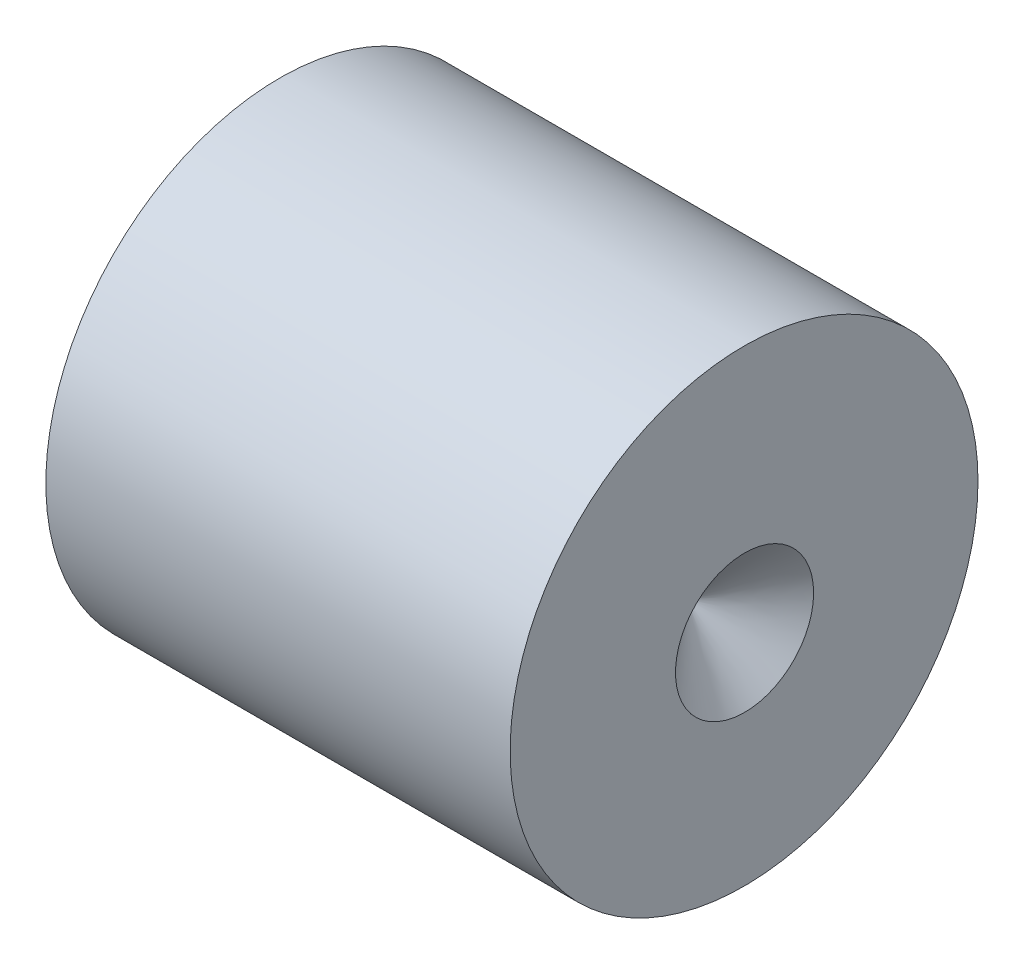
ISO-10303-21;
HEADER;
FILE_DESCRIPTION(('STEP AP214'),'2;1');
FILE_NAME('part.step','',(''),(''),'','','');
FILE_SCHEMA(('AUTOMOTIVE_DESIGN { 1 0 10303 214 1 1 1 1 }'));
ENDSEC;
DATA;
#1=APPLICATION_CONTEXT('core data for automotive mechanical design processes');
#2=APPLICATION_PROTOCOL_DEFINITION('international standard','automotive_design',2000,#1);
#3=PRODUCT_CONTEXT('',#1,'mechanical');
#4=PRODUCT('Part','Part','',(#3));
#5=PRODUCT_RELATED_PRODUCT_CATEGORY('part','',(#4));
#6=PRODUCT_DEFINITION_FORMATION('','',#4);
#7=PRODUCT_DEFINITION_CONTEXT('part definition',#1,'design');
#8=PRODUCT_DEFINITION('design','',#6,#7);
#9=PRODUCT_DEFINITION_SHAPE('','',#8);
#10=(LENGTH_UNIT() NAMED_UNIT(*) SI_UNIT(.MILLI.,.METRE.));
#11=(NAMED_UNIT(*) PLANE_ANGLE_UNIT() SI_UNIT($,.RADIAN.));
#12=(NAMED_UNIT(*) SI_UNIT($,.STERADIAN.) SOLID_ANGLE_UNIT());
#13=UNCERTAINTY_MEASURE_WITH_UNIT(LENGTH_MEASURE(1.E-05),#10,'distance_accuracy_value','');
#14=(GEOMETRIC_REPRESENTATION_CONTEXT(3) GLOBAL_UNCERTAINTY_ASSIGNED_CONTEXT((#13)) GLOBAL_UNIT_ASSIGNED_CONTEXT((#10,
#11,#12)) REPRESENTATION_CONTEXT('',''));
#15=CARTESIAN_POINT('',(0.,0.,0.));
#16=DIRECTION('',(0.,0.,1.));
#17=DIRECTION('',(1.,0.,0.));
#18=AXIS2_PLACEMENT_3D('',#15,#16,#17);
#19=CARTESIAN_POINT('',(10.16,45.8221014837827,7.97795516905145));
#20=DIRECTION('',(-1.,0.,0.));
#21=DIRECTION('',(0.,0.,1.));
#22=AXIS2_PLACEMENT_3D('',#19,#20,#21);
#23=CYLINDRICAL_SURFACE('',#22,5.11907181179017);
#24=CARTESIAN_POINT('',(10.16,45.8221014837827,7.97795516905145));
#25=DIRECTION('',(1.,0.,0.));
#26=DIRECTION('',(0.,0.,-1.));
#27=AXIS2_PLACEMENT_3D('',#24,#25,#26);
#28=CIRCLE('',#27,5.11907181179017);
#29=CARTESIAN_POINT('',(10.16,45.8221014837827,2.85888335726128));
#30=VERTEX_POINT('',#29);
#31=EDGE_CURVE('E11',#30,#30,#28,.T.);
#32=ORIENTED_EDGE('',*,*,#31,.F.);
#33=EDGE_LOOP('',(#32));
#34=FACE_BOUND('',#33,.T.);
#35=CARTESIAN_POINT('',(0.,45.8221014837827,7.97795516905145));
#36=DIRECTION('',(1.,0.,0.));
#37=DIRECTION('',(0.,0.,-1.));
#38=AXIS2_PLACEMENT_3D('',#35,#36,#37);
#39=CIRCLE('',#38,5.11907181179017);
#40=CARTESIAN_POINT('',(0.,45.8221014837827,2.85888335726128));
#41=VERTEX_POINT('',#40);
#42=EDGE_CURVE('E36',#41,#41,#39,.T.);
#43=ORIENTED_EDGE('',*,*,#42,.T.);
#44=EDGE_LOOP('',(#43));
#45=FACE_BOUND('',#44,.T.);
#46=ADVANCED_FACE('F33',(#34,#45),#23,.T.);
#47=CARTESIAN_POINT('',(10.16,45.8221014837827,7.97795516905145));
#48=DIRECTION('',(1.,0.,0.));
#49=DIRECTION('',(0.,0.,-1.));
#50=AXIS2_PLACEMENT_3D('',#47,#48,#49);
#51=PLANE('',#50);
#52=CARTESIAN_POINT('',(10.16,45.5023528736015,7.96695319802565));
#53=DIRECTION('',(1.,0.,0.));
#54=DIRECTION('',(0.,0.,-1.));
#55=AXIS2_PLACEMENT_3D('',#52,#53,#54);
#56=CIRCLE('',#55,1.5113);
#57=CARTESIAN_POINT('',(10.16,45.5023528736015,6.45565319802565));
#58=VERTEX_POINT('',#57);
#59=EDGE_CURVE('E56',#58,#58,#56,.T.);
#60=ORIENTED_EDGE('',*,*,#59,.F.);
#61=EDGE_LOOP('',(#60));
#62=FACE_BOUND('',#61,.T.);
#63=ORIENTED_EDGE('',*,*,#31,.T.);
#64=EDGE_LOOP('',(#63));
#65=FACE_BOUND('',#64,.T.);
#66=ADVANCED_FACE('F80',(#62,#65),#51,.T.);
#67=CARTESIAN_POINT('',(0.,45.8221014837827,7.97795516905145));
#68=DIRECTION('',(1.,0.,0.));
#69=DIRECTION('',(0.,0.,-1.));
#70=AXIS2_PLACEMENT_3D('',#67,#68,#69);
#71=PLANE('',#70);
#72=CARTESIAN_POINT('',(0.,45.6054879122403,8.0544553026329));
#73=DIRECTION('',(-1.,0.,0.));
#74=DIRECTION('',(0.,0.,1.));
#75=AXIS2_PLACEMENT_3D('',#72,#73,#74);
#76=CIRCLE('',#75,1.5113);
#77=CARTESIAN_POINT('',(0.,45.6054879122403,9.5657553026329));
#78=VERTEX_POINT('',#77);
#79=EDGE_CURVE('E63',#78,#78,#76,.T.);
#80=ORIENTED_EDGE('',*,*,#79,.F.);
#81=EDGE_LOOP('',(#80));
#82=FACE_BOUND('',#81,.T.);
#83=ORIENTED_EDGE('',*,*,#42,.F.);
#84=EDGE_LOOP('',(#83));
#85=FACE_BOUND('',#84,.T.);
#86=ADVANCED_FACE('F77',(#82,#85),#71,.F.);
#87=CARTESIAN_POINT('',(6.096,45.5023528736015,7.96695319802565));
#88=DIRECTION('',(1.,0.,0.));
#89=DIRECTION('',(0.,0.,-1.));
#90=AXIS2_PLACEMENT_3D('',#87,#88,#89);
#91=CONICAL_SURFACE('',#90,0.0749300000000008,1.02974425867666);
#92=CARTESIAN_POINT('',(6.05097751381627,45.5023528736015,7.96695319802565));
#93=VERTEX_POINT('',#92);
#94=VERTEX_LOOP('',#93);
#95=FACE_BOUND('',#94,.T.);
#96=CARTESIAN_POINT('',(6.096,45.5023528736015,7.96695319802565));
#97=DIRECTION('',(1.,0.,0.));
#98=DIRECTION('',(0.,0.,-1.));
#99=AXIS2_PLACEMENT_3D('',#96,#97,#98);
#100=CIRCLE('',#99,0.0749300000000008);
#101=CARTESIAN_POINT('',(6.096,45.5023528736015,7.89202319802565));
#102=VERTEX_POINT('',#101);
#103=EDGE_CURVE('E69',#102,#102,#100,.T.);
#104=ORIENTED_EDGE('',*,*,#103,.T.);
#105=EDGE_LOOP('',(#104));
#106=FACE_BOUND('',#105,.T.);
#107=ADVANCED_FACE('F79',(#95,#106),#91,.F.);
#108=CARTESIAN_POINT('',(10.16,45.5023528736015,7.96695319802565));
#109=DIRECTION('',(1.,0.,0.));
#110=DIRECTION('',(0.,0.,-1.));
#111=AXIS2_PLACEMENT_3D('',#108,#109,#110);
#112=CYLINDRICAL_SURFACE('',#111,0.0749300000000008);
#113=ORIENTED_EDGE('',*,*,#103,.F.);
#114=EDGE_LOOP('',(#113));
#115=FACE_BOUND('',#114,.T.);
#116=CARTESIAN_POINT('',(8.95474246276589,45.5023528736015,7.96695319802565));
#117=DIRECTION('',(1.,0.,0.));
#118=DIRECTION('',(0.,0.,-1.));
#119=AXIS2_PLACEMENT_3D('',#116,#117,#118);
#120=CIRCLE('',#119,0.0749300000000008);
#121=CARTESIAN_POINT('',(8.95474246276589,45.5023528736015,7.89202319802565));
#122=VERTEX_POINT('',#121);
#123=EDGE_CURVE('E60',#122,#122,#120,.T.);
#124=ORIENTED_EDGE('',*,*,#123,.T.);
#125=EDGE_LOOP('',(#124));
#126=FACE_BOUND('',#125,.T.);
#127=ADVANCED_FACE('F87',(#115,#126),#112,.F.);
#128=CARTESIAN_POINT('',(10.16,45.5023528736015,7.96695319802565));
#129=DIRECTION('',(1.,0.,0.));
#130=DIRECTION('',(0.,0.,-1.));
#131=AXIS2_PLACEMENT_3D('',#128,#129,#130);
#132=CONICAL_SURFACE('',#131,1.5113,0.872664625997163);
#133=CARTESIAN_POINT('',(8.95474246276589,45.5023528736015,7.89202319802565));
#134=CARTESIAN_POINT('',(8.96729722877875,45.5023528736015,7.87706101052565));
#135=CARTESIAN_POINT('',(8.9798519947916,45.5023528736015,7.86209882302565));
#136=CARTESIAN_POINT('',(9.00496152681731,45.5023528736015,7.83217444802565));
#137=CARTESIAN_POINT('',(9.01751629283017,45.5023528736015,7.81721226052565));
#138=CARTESIAN_POINT('',(9.04262582485588,45.5023528736015,7.78728788552565));
#139=CARTESIAN_POINT('',(9.05518059086873,45.5023528736015,7.77232569802565));
#140=CARTESIAN_POINT('',(9.08029012289444,45.5023528736015,7.74240132302565));
#141=CARTESIAN_POINT('',(9.0928448889073,45.5023528736015,7.72743913552565));
#142=CARTESIAN_POINT('',(9.11795442093301,45.5023528736015,7.69751476052565));
#143=CARTESIAN_POINT('',(9.13050918694586,45.5023528736015,7.68255257302565));
#144=CARTESIAN_POINT('',(9.15561871897157,45.5023528736015,7.65262819802565));
#145=CARTESIAN_POINT('',(9.16817348498443,45.5023528736015,7.63766601052565));
#146=CARTESIAN_POINT('',(9.19328301701014,45.5023528736015,7.60774163552565));
#147=CARTESIAN_POINT('',(9.20583778302299,45.5023528736015,7.59277944802565));
#148=CARTESIAN_POINT('',(9.23094731504871,45.5023528736015,7.56285507302565));
#149=CARTESIAN_POINT('',(9.24350208106156,45.5023528736015,7.54789288552565));
#150=CARTESIAN_POINT('',(9.26861161308727,45.5023528736015,7.51796851052565));
#151=CARTESIAN_POINT('',(9.28116637910013,45.5023528736015,7.50300632302565));
#152=CARTESIAN_POINT('',(9.30627591112584,45.5023528736015,7.47308194802565));
#153=CARTESIAN_POINT('',(9.31883067713869,45.5023528736015,7.45811976052565));
#154=CARTESIAN_POINT('',(9.3439402091644,45.5023528736015,7.42819538552565));
#155=CARTESIAN_POINT('',(9.35649497517726,45.5023528736015,7.41323319802565));
#156=CARTESIAN_POINT('',(9.38160450720297,45.5023528736015,7.38330882302565));
#157=CARTESIAN_POINT('',(9.39415927321583,45.5023528736015,7.36834663552565));
#158=CARTESIAN_POINT('',(9.41926880524154,45.5023528736015,7.33842226052565));
#159=CARTESIAN_POINT('',(9.43182357125439,45.5023528736015,7.32346007302565));
#160=CARTESIAN_POINT('',(9.4569331032801,45.5023528736015,7.29353569802565));
#161=CARTESIAN_POINT('',(9.46948786929296,45.5023528736015,7.27857351052565));
#162=CARTESIAN_POINT('',(9.49459740131867,45.5023528736015,7.24864913552565));
#163=CARTESIAN_POINT('',(9.50715216733152,45.5023528736015,7.23368694802565));
#164=CARTESIAN_POINT('',(9.53226169935723,45.5023528736015,7.20376257302565));
#165=CARTESIAN_POINT('',(9.54481646537009,45.5023528736015,7.18880038552565));
#166=CARTESIAN_POINT('',(9.5699259973958,45.5023528736015,7.15887601052565));
#167=CARTESIAN_POINT('',(9.58248076340866,45.5023528736015,7.14391382302565));
#168=CARTESIAN_POINT('',(9.60759029543437,45.5023528736015,7.11398944802565));
#169=CARTESIAN_POINT('',(9.62014506144722,45.5023528736015,7.09902726052565));
#170=CARTESIAN_POINT('',(9.64525459347293,45.5023528736015,7.06910288552565));
#171=CARTESIAN_POINT('',(9.65780935948579,45.5023528736015,7.05414069802565));
#172=CARTESIAN_POINT('',(9.6829188915115,45.5023528736015,7.02421632302565));
#173=CARTESIAN_POINT('',(9.69547365752435,45.5023528736015,7.00925413552565));
#174=CARTESIAN_POINT('',(9.72058318955006,45.5023528736015,6.97932976052565));
#175=CARTESIAN_POINT('',(9.73313795556292,45.5023528736015,6.96436757302565));
#176=CARTESIAN_POINT('',(9.75824748758863,45.5023528736015,6.93444319802565));
#177=CARTESIAN_POINT('',(9.77080225360149,45.5023528736015,6.91948101052565));
#178=CARTESIAN_POINT('',(9.7959117856272,45.5023528736015,6.88955663552565));
#179=CARTESIAN_POINT('',(9.80846655164005,45.5023528736015,6.87459444802565));
#180=CARTESIAN_POINT('',(9.83357608366576,45.5023528736015,6.84467007302565));
#181=CARTESIAN_POINT('',(9.84613084967862,45.5023528736015,6.82970788552565));
#182=CARTESIAN_POINT('',(9.87124038170433,45.5023528736015,6.79978351052565));
#183=CARTESIAN_POINT('',(9.88379514771719,45.5023528736015,6.78482132302565));
#184=CARTESIAN_POINT('',(9.90890467974289,45.5023528736015,6.75489694802565));
#185=CARTESIAN_POINT('',(9.92145944575575,45.5023528736015,6.73993476052565));
#186=CARTESIAN_POINT('',(9.94656897778146,45.5023528736015,6.71001038552565));
#187=CARTESIAN_POINT('',(9.95912374379432,45.5023528736015,6.69504819802565));
#188=CARTESIAN_POINT('',(9.98423327582003,45.5023528736015,6.66512382302565));
#189=CARTESIAN_POINT('',(9.99678804183288,45.5023528736015,6.65016163552565));
#190=CARTESIAN_POINT('',(10.0218975738586,45.5023528736015,6.62023726052565));
#191=CARTESIAN_POINT('',(10.0344523398714,45.5023528736015,6.60527507302565));
#192=CARTESIAN_POINT('',(10.0595618718972,45.5023528736015,6.57535069802565));
#193=CARTESIAN_POINT('',(10.07211663791,45.5023528736015,6.56038851052565));
#194=CARTESIAN_POINT('',(10.0972261699357,45.5023528736015,6.53046413552565));
#195=CARTESIAN_POINT('',(10.1097809359486,45.5023528736015,6.51550194802565));
#196=CARTESIAN_POINT('',(10.1348904679743,45.5023528736015,6.48557757302565));
#197=CARTESIAN_POINT('',(10.1474452339871,45.5023528736015,6.47061538552565));
#198=CARTESIAN_POINT('',(10.16,45.5023528736015,6.45565319802565));
#199=B_SPLINE_CURVE_WITH_KNOTS('',3,(#133,#134,#135,#136,#137,#138,#139,#140,#141,#142,#143,
#144,#145,#146,#147,#148,#149,#150,#151,#152,#153,#154,#155,#156,#157,#158,#159,#160,#161,#162,
#163,#164,#165,#166,#167,#168,#169,#170,#171,#172,#173,#174,#175,#176,#177,#178,#179,#180,#181,
#182,#183,#184,#185,#186,#187,#188,#189,#190,#191,#192,#193,#194,#195,#196,#197,#198),
.UNSPECIFIED.,.F.,.F.,(4,2,2,2,2,2,2,2,2,2,2,2,2,2,2,2,2,2,2,2,2,2,2,2,2,2,2,2,2,2,2,2,4),(0.,
0.0585952458805693,0.117190491761139,0.175785737641707,0.234380983522276,0.292976229402845,
0.351571475283413,0.410166721163983,0.468761967044551,0.527357212925121,0.58595245880569,
0.644547704686259,0.703142950566828,0.761738196447396,0.820333442327965,0.878928688208534,
0.937523934089104,0.996119179969673,1.05471442585024,1.11330967173081,1.17190491761138,
1.23050016349195,1.28909540937252,1.34769065525309,1.40628590113365,1.46488114701422,
1.52347639289479,1.58207163877536,1.64066688465593,1.6992621305365,1.75785737641707,
1.81645262229764,1.87504786817821),.UNSPECIFIED.);
#200=EDGE_CURVE('BSEAM50',#122,#58,#199,.T.);
#201=ORIENTED_EDGE('',*,*,#123,.F.);
#202=ORIENTED_EDGE('',*,*,#59,.T.);
#203=ORIENTED_EDGE('',*,*,#200,.T.);
#204=ORIENTED_EDGE('',*,*,#200,.F.);
#205=EDGE_LOOP('',(#201,#203,#202,#204));
#206=FACE_BOUND('',#205,.T.);
#207=ADVANCED_FACE('F50',(#206),#132,.F.);
#208=CARTESIAN_POINT('',(4.064,45.6054879122403,8.0544553026329));
#209=DIRECTION('',(-1.,0.,0.));
#210=DIRECTION('',(0.,0.,1.));
#211=AXIS2_PLACEMENT_3D('',#208,#209,#210);
#212=CONICAL_SURFACE('',#211,0.074929999999987,1.02974425867656);
#213=CARTESIAN_POINT('',(4.10902248618374,45.6054879122403,8.0544553026329));
#214=VERTEX_POINT('',#213);
#215=VERTEX_LOOP('',#214);
#216=FACE_BOUND('',#215,.T.);
#217=CARTESIAN_POINT('',(4.064,45.6054879122403,8.0544553026329));
#218=DIRECTION('',(-1.,0.,0.));
#219=DIRECTION('',(0.,0.,1.));
#220=AXIS2_PLACEMENT_3D('',#217,#218,#219);
#221=CIRCLE('',#220,0.074929999999987);
#222=CARTESIAN_POINT('',(4.064,45.6054879122403,8.12938530263288));
#223=VERTEX_POINT('',#222);
#224=EDGE_CURVE('E54',#223,#223,#221,.T.);
#225=ORIENTED_EDGE('',*,*,#224,.T.);
#226=EDGE_LOOP('',(#225));
#227=FACE_BOUND('',#226,.T.);
#228=ADVANCED_FACE('F46',(#216,#227),#212,.F.);
#229=CARTESIAN_POINT('',(0.,45.6054879122403,8.0544553026329));
#230=DIRECTION('',(-1.,0.,0.));
#231=DIRECTION('',(0.,0.,1.));
#232=AXIS2_PLACEMENT_3D('',#229,#230,#231);
#233=CYLINDRICAL_SURFACE('',#232,0.074929999999987);
#234=ORIENTED_EDGE('',*,*,#224,.F.);
#235=EDGE_LOOP('',(#234));
#236=FACE_BOUND('',#235,.T.);
#237=CARTESIAN_POINT('',(1.20525753723412,45.6054879122403,8.0544553026329));
#238=DIRECTION('',(-1.,0.,0.));
#239=DIRECTION('',(0.,0.,1.));
#240=AXIS2_PLACEMENT_3D('',#237,#238,#239);
#241=CIRCLE('',#240,0.074929999999987);
#242=CARTESIAN_POINT('',(1.20525753723412,45.6054879122403,8.12938530263288));
#243=VERTEX_POINT('',#242);
#244=EDGE_CURVE('E57',#243,#243,#241,.T.);
#245=ORIENTED_EDGE('',*,*,#244,.T.);
#246=EDGE_LOOP('',(#245));
#247=FACE_BOUND('',#246,.T.);
#248=ADVANCED_FACE('F49',(#236,#247),#233,.F.);
#249=CARTESIAN_POINT('',(0.,45.6054879122403,8.0544553026329));
#250=DIRECTION('',(-1.,0.,0.));
#251=DIRECTION('',(0.,0.,1.));
#252=AXIS2_PLACEMENT_3D('',#249,#250,#251);
#253=CONICAL_SURFACE('',#252,1.5113,0.872664625997165);
#254=CARTESIAN_POINT('',(1.20525753723412,45.6054879122403,8.12938530263288));
#255=CARTESIAN_POINT('',(1.19270277122126,45.6054879122403,8.14434749013288));
#256=CARTESIAN_POINT('',(1.18014800520841,45.6054879122403,8.15930967763288));
#257=CARTESIAN_POINT('',(1.1550384731827,45.6054879122403,8.18923405263288));
#258=CARTESIAN_POINT('',(1.14248370716984,45.6054879122403,8.20419624013288));
#259=CARTESIAN_POINT('',(1.11737417514413,45.6054879122403,8.23412061513288));
#260=CARTESIAN_POINT('',(1.10481940913128,45.6054879122403,8.24908280263289));
#261=CARTESIAN_POINT('',(1.07970987710557,45.6054879122403,8.27900717763289));
#262=CARTESIAN_POINT('',(1.06715511109271,45.6054879122403,8.29396936513289));
#263=CARTESIAN_POINT('',(1.042045579067,45.6054879122403,8.32389374013289));
#264=CARTESIAN_POINT('',(1.02949081305414,45.6054879122403,8.33885592763288));
#265=CARTESIAN_POINT('',(1.00438128102843,45.6054879122403,8.36878030263289));
#266=CARTESIAN_POINT('',(0.991826515015577,45.6054879122403,8.38374249013289));
#267=CARTESIAN_POINT('',(0.966716982989866,45.6054879122403,8.41366686513289));
#268=CARTESIAN_POINT('',(0.954162216977011,45.6054879122403,8.42862905263289));
#269=CARTESIAN_POINT('',(0.9290526849513,45.6054879122403,8.45855342763289));
#270=CARTESIAN_POINT('',(0.916497918938445,45.6054879122403,8.47351561513289));
#271=CARTESIAN_POINT('',(0.891388386912734,45.6054879122403,8.50343999013289));
#272=CARTESIAN_POINT('',(0.878833620899878,45.6054879122403,8.51840217763289));
#273=CARTESIAN_POINT('',(0.853724088874168,45.6054879122403,8.54832655263289));
#274=CARTESIAN_POINT('',(0.841169322861312,45.6054879122403,8.56328874013289));
#275=CARTESIAN_POINT('',(0.816059790835601,45.6054879122403,8.59321311513289));
#276=CARTESIAN_POINT('',(0.803505024822746,45.6054879122403,8.60817530263289));
#277=CARTESIAN_POINT('',(0.778395492797035,45.6054879122403,8.63809967763289));
#278=CARTESIAN_POINT('',(0.765840726784179,45.6054879122403,8.65306186513289));
#279=CARTESIAN_POINT('',(0.740731194758468,45.6054879122403,8.68298624013289));
#280=CARTESIAN_POINT('',(0.728176428745613,45.6054879122403,8.69794842763289));
#281=CARTESIAN_POINT('',(0.703066896719902,45.6054879122403,8.72787280263289));
#282=CARTESIAN_POINT('',(0.690512130707047,45.6054879122403,8.74283499013289));
#283=CARTESIAN_POINT('',(0.665402598681336,45.6054879122403,8.77275936513289));
#284=CARTESIAN_POINT('',(0.652847832668481,45.6054879122403,8.78772155263289));
#285=CARTESIAN_POINT('',(0.62773830064277,45.6054879122403,8.81764592763289));
#286=CARTESIAN_POINT('',(0.615183534629914,45.6054879122403,8.83260811513289));
#287=CARTESIAN_POINT('',(0.590074002604204,45.6054879122403,8.86253249013289));
#288=CARTESIAN_POINT('',(0.577519236591348,45.6054879122403,8.87749467763289));
#289=CARTESIAN_POINT('',(0.552409704565637,45.6054879122403,8.90741905263289));
#290=CARTESIAN_POINT('',(0.539854938552782,45.6054879122403,8.92238124013289));
#291=CARTESIAN_POINT('',(0.514745406527071,45.6054879122403,8.95230561513289));
#292=CARTESIAN_POINT('',(0.502190640514215,45.6054879122403,8.96726780263289));
#293=CARTESIAN_POINT('',(0.477081108488505,45.6054879122403,8.99719217763289));
#294=CARTESIAN_POINT('',(0.464526342475649,45.6054879122403,9.01215436513289));
#295=CARTESIAN_POINT('',(0.439416810449938,45.6054879122403,9.04207874013289));
#296=CARTESIAN_POINT('',(0.426862044437083,45.6054879122403,9.05704092763289));
#297=CARTESIAN_POINT('',(0.401752512411372,45.6054879122403,9.08696530263289));
#298=CARTESIAN_POINT('',(0.389197746398517,45.6054879122403,9.10192749013289));
#299=CARTESIAN_POINT('',(0.364088214372806,45.6054879122403,9.13185186513289));
#300=CARTESIAN_POINT('',(0.35153344835995,45.6054879122403,9.14681405263289));
#301=CARTESIAN_POINT('',(0.326423916334239,45.6054879122403,9.17673842763289));
#302=CARTESIAN_POINT('',(0.313869150321384,45.6054879122403,9.19170061513289));
#303=CARTESIAN_POINT('',(0.288759618295673,45.6054879122403,9.22162499013289));
#304=CARTESIAN_POINT('',(0.276204852282818,45.6054879122403,9.23658717763289));
#305=CARTESIAN_POINT('',(0.251095320257107,45.6054879122403,9.26651155263289));
#306=CARTESIAN_POINT('',(0.238540554244252,45.6054879122403,9.28147374013289));
#307=CARTESIAN_POINT('',(0.213431022218541,45.6054879122403,9.31139811513289));
#308=CARTESIAN_POINT('',(0.200876256205685,45.6054879122403,9.3263603026329));
#309=CARTESIAN_POINT('',(0.175766724179974,45.6054879122403,9.3562846776329));
#310=CARTESIAN_POINT('',(0.163211958167119,45.6054879122403,9.37124686513289));
#311=CARTESIAN_POINT('',(0.138102426141408,45.6054879122403,9.40117124013289));
#312=CARTESIAN_POINT('',(0.125547660128553,45.6054879122403,9.41613342763289));
#313=CARTESIAN_POINT('',(0.100438128102842,45.6054879122403,9.44605780263289));
#314=CARTESIAN_POINT('',(0.0878833620899862,45.6054879122403,9.4610199901329));
#315=CARTESIAN_POINT('',(0.0627738300642753,45.6054879122403,9.4909443651329));
#316=CARTESIAN_POINT('',(0.0502190640514199,45.6054879122403,9.5059065526329));
#317=CARTESIAN_POINT('',(0.0251095320257091,45.6054879122403,9.5358309276329));
#318=CARTESIAN_POINT('',(0.0125547660128537,45.6054879122403,9.5507931151329));
#319=CARTESIAN_POINT('',(0.,45.6054879122403,9.5657553026329));
#320=B_SPLINE_CURVE_WITH_KNOTS('',3,(#254,#255,#256,#257,#258,#259,#260,#261,#262,#263,#264,
#265,#266,#267,#268,#269,#270,#271,#272,#273,#274,#275,#276,#277,#278,#279,#280,#281,#282,#283,
#284,#285,#286,#287,#288,#289,#290,#291,#292,#293,#294,#295,#296,#297,#298,#299,#300,#301,#302,
#303,#304,#305,#306,#307,#308,#309,#310,#311,#312,#313,#314,#315,#316,#317,#318,#319),
.UNSPECIFIED.,.F.,.F.,(4,2,2,2,2,2,2,2,2,2,2,2,2,2,2,2,2,2,2,2,2,2,2,2,2,2,2,2,2,2,2,2,4),(0.,
0.0585952458805696,0.117190491761139,0.175785737641709,0.234380983522279,0.292976229402847,
0.351571475283417,0.410166721163986,0.468761967044556,0.527357212925125,0.585952458805695,
0.644547704686265,0.703142950566833,0.761738196447402,0.820333442327972,0.878928688208542,
0.937523934089111,0.996119179969681,1.05471442585025,1.11330967173082,1.17190491761139,
1.23050016349196,1.28909540937253,1.3476906552531,1.40628590113367,1.46488114701424,
1.52347639289481,1.58207163877538,1.64066688465594,1.69926213053651,1.75785737641708,
1.81645262229765,1.87504786817822),.UNSPECIFIED.);
#321=EDGE_CURVE('BSEAM135',#243,#78,#320,.T.);
#322=ORIENTED_EDGE('',*,*,#244,.F.);
#323=ORIENTED_EDGE('',*,*,#79,.T.);
#324=ORIENTED_EDGE('',*,*,#321,.T.);
#325=ORIENTED_EDGE('',*,*,#321,.F.);
#326=EDGE_LOOP('',(#322,#324,#323,#325));
#327=FACE_BOUND('',#326,.T.);
#328=ADVANCED_FACE('F135',(#327),#253,.F.);
#329=CLOSED_SHELL('',(#46,#66,#86,#107,#127,#207,#228,#248,#328));
#330=MANIFOLD_SOLID_BREP('B2',#329);
#331=ADVANCED_BREP_SHAPE_REPRESENTATION('',(#18,#330),#14);
#332=SHAPE_DEFINITION_REPRESENTATION(#9,#331);
ENDSEC;
END-ISO-10303-21;
